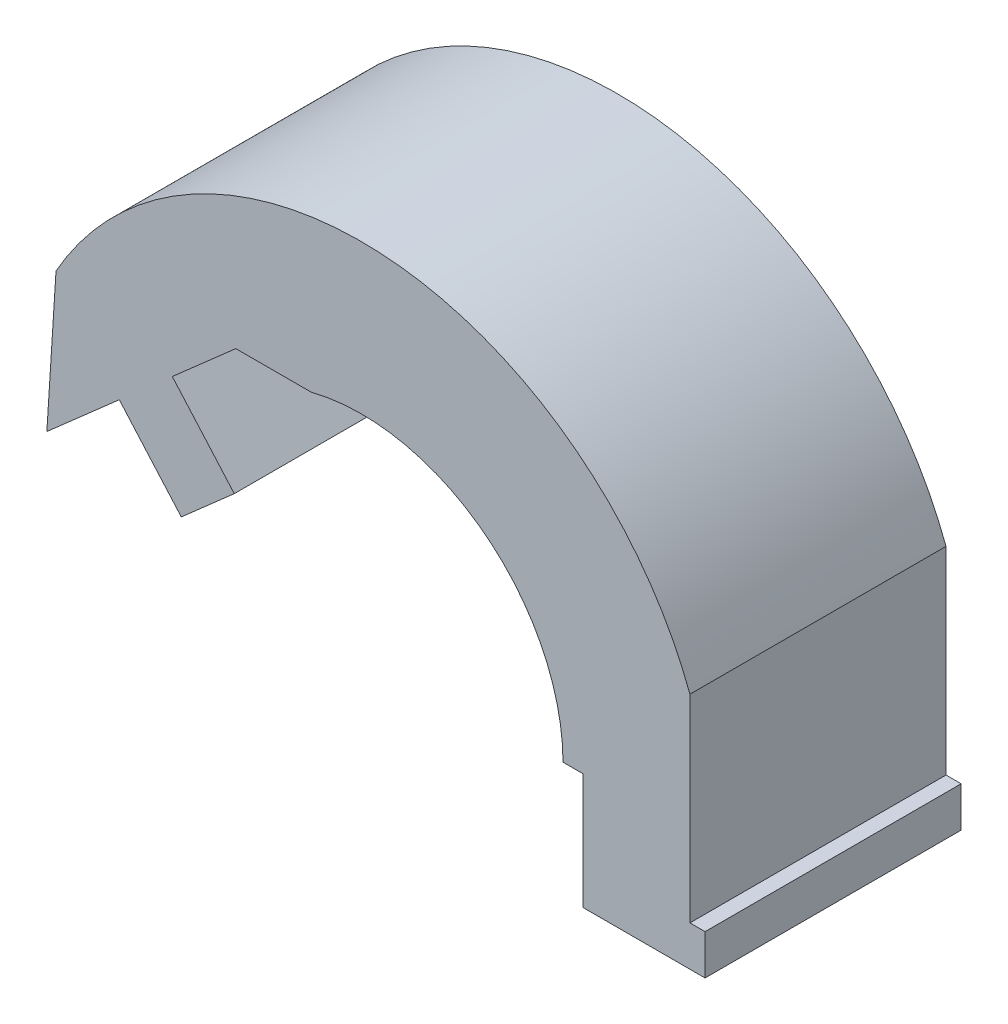
ISO-10303-21;
HEADER;
FILE_DESCRIPTION(('STEP AP214'),'2;1');
FILE_NAME('part.step','',(''),(''),'','','');
FILE_SCHEMA(('AUTOMOTIVE_DESIGN { 1 0 10303 214 1 1 1 1 }'));
ENDSEC;
DATA;
#1=APPLICATION_CONTEXT('core data for automotive mechanical design processes');
#2=APPLICATION_PROTOCOL_DEFINITION('international standard','automotive_design',2000,#1);
#3=PRODUCT_CONTEXT('',#1,'mechanical');
#4=PRODUCT('Part','Part','',(#3));
#5=PRODUCT_RELATED_PRODUCT_CATEGORY('part','',(#4));
#6=PRODUCT_DEFINITION_FORMATION('','',#4);
#7=PRODUCT_DEFINITION_CONTEXT('part definition',#1,'design');
#8=PRODUCT_DEFINITION('design','',#6,#7);
#9=PRODUCT_DEFINITION_SHAPE('','',#8);
#10=(LENGTH_UNIT() NAMED_UNIT(*) SI_UNIT(.MILLI.,.METRE.));
#11=(NAMED_UNIT(*) PLANE_ANGLE_UNIT() SI_UNIT($,.RADIAN.));
#12=(NAMED_UNIT(*) SI_UNIT($,.STERADIAN.) SOLID_ANGLE_UNIT());
#13=UNCERTAINTY_MEASURE_WITH_UNIT(LENGTH_MEASURE(1.E-05),#10,'distance_accuracy_value','');
#14=(GEOMETRIC_REPRESENTATION_CONTEXT(3) GLOBAL_UNCERTAINTY_ASSIGNED_CONTEXT((#13)) GLOBAL_UNIT_ASSIGNED_CONTEXT((#10,
#11,#12)) REPRESENTATION_CONTEXT('',''));
#15=CARTESIAN_POINT('',(0.,0.,0.));
#16=DIRECTION('',(0.,0.,1.));
#17=DIRECTION('',(1.,0.,0.));
#18=AXIS2_PLACEMENT_3D('',#15,#16,#17);
#19=CARTESIAN_POINT('',(-37.0887037482925,13.239242579813,-12.7));
#20=DIRECTION('',(0.660656213966803,-0.750688595189143,0.));
#21=DIRECTION('',(0.750688595189144,0.660656213966803,0.));
#22=AXIS2_PLACEMENT_3D('',#19,#20,#21);
#23=PLANE('',#22);
#24=DIRECTION('',(0.750688595189143,0.660656213966803,0.));
#25=VECTOR('',#24,1.);
#26=CARTESIAN_POINT('',(-37.0887037482925,13.239242579813,0.));
#27=LINE('',#26,#25);
#28=CARTESIAN_POINT('',(-37.2793786514705,13.0714359014654,0.));
#29=VERTEX_POINT('',#28);
#30=CARTESIAN_POINT('',(-34.1291770340786,15.8438241955142,0.));
#31=VERTEX_POINT('',#30);
#32=EDGE_CURVE('E212',#29,#31,#27,.T.);
#33=ORIENTED_EDGE('',*,*,#32,.F.);
#34=DIRECTION('',(0.,0.,1.));
#35=VECTOR('',#34,1.);
#36=CARTESIAN_POINT('',(-37.2793786514705,13.0714359014654,-12.7));
#37=LINE('',#36,#35);
#38=CARTESIAN_POINT('',(-37.2793786514705,13.0714359014654,-12.7));
#39=VERTEX_POINT('',#38);
#40=EDGE_CURVE('E11',#39,#29,#37,.T.);
#41=ORIENTED_EDGE('',*,*,#40,.F.);
#42=DIRECTION('',(0.750688595189145,0.660656213966802,0.));
#43=VECTOR('',#42,1.);
#44=CARTESIAN_POINT('',(-34.1291770340786,15.8438241955142,-12.7));
#45=LINE('',#44,#43);
#46=CARTESIAN_POINT('',(-34.1291770340786,15.8438241955142,-12.7));
#47=VERTEX_POINT('',#46);
#48=EDGE_CURVE('E52',#39,#47,#45,.T.);
#49=ORIENTED_EDGE('',*,*,#48,.T.);
#50=DIRECTION('',(0.,0.,1.));
#51=VECTOR('',#50,1.);
#52=CARTESIAN_POINT('',(-34.1291770340786,15.8438241955142,-12.7));
#53=LINE('',#52,#51);
#54=EDGE_CURVE('E37',#47,#31,#53,.T.);
#55=ORIENTED_EDGE('',*,*,#54,.T.);
#56=EDGE_LOOP('',(#33,#41,#49,#55));
#57=FACE_BOUND('',#56,.T.);
#58=ADVANCED_FACE('F33',(#57),#23,.T.);
#59=CARTESIAN_POINT('',(-37.2793786514705,13.0714359014654,-12.7));
#60=DIRECTION('',(0.750688595189145,0.660656213966801,0.));
#61=DIRECTION('',(-0.660656213966801,0.750688595189145,0.));
#62=AXIS2_PLACEMENT_3D('',#59,#60,#61);
#63=PLANE('',#62);
#64=DIRECTION('',(-0.660656213966801,0.750688595189145,0.));
#65=VECTOR('',#64,1.);
#66=CARTESIAN_POINT('',(-37.2793786514705,13.0714359014654,0.));
#67=LINE('',#66,#65);
#68=CARTESIAN_POINT('',(-34.203525113416,9.57641364529731,0.));
#69=VERTEX_POINT('',#68);
#70=EDGE_CURVE('E210',#69,#29,#67,.T.);
#71=ORIENTED_EDGE('',*,*,#70,.F.);
#72=DIRECTION('',(0.,0.,1.));
#73=VECTOR('',#72,1.);
#74=CARTESIAN_POINT('',(-34.203525113416,9.57641364529731,-12.7));
#75=LINE('',#74,#73);
#76=CARTESIAN_POINT('',(-34.203525113416,9.57641364529731,-12.7));
#77=VERTEX_POINT('',#76);
#78=EDGE_CURVE('E43',#77,#69,#75,.T.);
#79=ORIENTED_EDGE('',*,*,#78,.F.);
#80=DIRECTION('',(-0.660656213966801,0.750688595189145,0.));
#81=VECTOR('',#80,1.);
#82=CARTESIAN_POINT('',(-37.2793786514705,13.0714359014654,-12.7));
#83=LINE('',#82,#81);
#84=EDGE_CURVE('E163',#77,#39,#83,.T.);
#85=ORIENTED_EDGE('',*,*,#84,.T.);
#86=ORIENTED_EDGE('',*,*,#40,.T.);
#87=EDGE_LOOP('',(#71,#79,#85,#86));
#88=FACE_BOUND('',#87,.T.);
#89=ADVANCED_FACE('F241',(#88),#63,.T.);
#90=CARTESIAN_POINT('',(-34.203525113416,9.57641364529731,-12.7));
#91=DIRECTION('',(0.660656213966801,-0.750688595189145,0.));
#92=DIRECTION('',(0.750688595189145,0.660656213966801,0.));
#93=AXIS2_PLACEMENT_3D('',#90,#91,#92);
#94=PLANE('',#93);
#95=DIRECTION('',(0.750688595189145,0.660656213966801,0.));
#96=VECTOR('',#95,1.);
#97=CARTESIAN_POINT('',(-34.203525113416,9.57641364529731,0.));
#98=LINE('',#97,#96);
#99=CARTESIAN_POINT('',(-36.8326030830114,7.26264904470577,0.));
#100=VERTEX_POINT('',#99);
#101=EDGE_CURVE('E152',#100,#69,#98,.T.);
#102=ORIENTED_EDGE('',*,*,#101,.F.);
#103=DIRECTION('',(0.,0.,1.));
#104=VECTOR('',#103,1.);
#105=CARTESIAN_POINT('',(-36.8326030830114,7.26264904470577,-12.7));
#106=LINE('',#105,#104);
#107=CARTESIAN_POINT('',(-36.8326030830114,7.26264904470577,-12.7));
#108=VERTEX_POINT('',#107);
#109=EDGE_CURVE('E147',#108,#100,#106,.T.);
#110=ORIENTED_EDGE('',*,*,#109,.F.);
#111=DIRECTION('',(0.750688595189145,0.660656213966801,0.));
#112=VECTOR('',#111,1.);
#113=CARTESIAN_POINT('',(-34.203525113416,9.57641364529731,-12.7));
#114=LINE('',#113,#112);
#115=EDGE_CURVE('E150',#108,#77,#114,.T.);
#116=ORIENTED_EDGE('',*,*,#115,.T.);
#117=ORIENTED_EDGE('',*,*,#78,.T.);
#118=EDGE_LOOP('',(#102,#110,#116,#117));
#119=FACE_BOUND('',#118,.T.);
#120=ADVANCED_FACE('F149',(#119),#94,.T.);
#121=CARTESIAN_POINT('',(-36.8326030830114,7.26264904470577,-12.7));
#122=DIRECTION('',(-0.750688595189144,-0.660656213966802,0.));
#123=DIRECTION('',(0.660656213966802,-0.750688595189145,0.));
#124=AXIS2_PLACEMENT_3D('',#121,#122,#123);
#125=PLANE('',#124);
#126=DIRECTION('',(0.660656213966802,-0.750688595189145,0.));
#127=VECTOR('',#126,1.);
#128=CARTESIAN_POINT('',(-36.8326030830114,7.26264904470577,0.));
#129=LINE('',#128,#127);
#130=CARTESIAN_POINT('',(-39.908456621066,10.7576713008739,0.));
#131=VERTEX_POINT('',#130);
#132=EDGE_CURVE('E207',#131,#100,#129,.T.);
#133=ORIENTED_EDGE('',*,*,#132,.F.);
#134=DIRECTION('',(0.,0.,1.));
#135=VECTOR('',#134,1.);
#136=CARTESIAN_POINT('',(-39.908456621066,10.7576713008739,-12.7));
#137=LINE('',#136,#135);
#138=CARTESIAN_POINT('',(-39.908456621066,10.7576713008739,-12.7));
#139=VERTEX_POINT('',#138);
#140=EDGE_CURVE('E157',#139,#131,#137,.T.);
#141=ORIENTED_EDGE('',*,*,#140,.F.);
#142=DIRECTION('',(0.660656213966802,-0.750688595189145,0.));
#143=VECTOR('',#142,1.);
#144=CARTESIAN_POINT('',(-36.8326030830114,7.26264904470577,-12.7));
#145=LINE('',#144,#143);
#146=EDGE_CURVE('E162',#139,#108,#145,.T.);
#147=ORIENTED_EDGE('',*,*,#146,.T.);
#148=ORIENTED_EDGE('',*,*,#109,.T.);
#149=EDGE_LOOP('',(#133,#141,#147,#148));
#150=FACE_BOUND('',#149,.T.);
#151=ADVANCED_FACE('F166',(#150),#125,.T.);
#152=CARTESIAN_POINT('',(-39.908456621066,10.7576713008739,-12.7));
#153=DIRECTION('',(0.660656213966805,-0.750688595189142,0.));
#154=DIRECTION('',(0.750688595189142,0.660656213966805,0.));
#155=AXIS2_PLACEMENT_3D('',#152,#153,#154);
#156=PLANE('',#155);
#157=DIRECTION('',(0.750688595189142,0.660656213966805,0.));
#158=VECTOR('',#157,1.);
#159=CARTESIAN_POINT('',(-39.908456621066,10.7576713008739,0.));
#160=LINE('',#159,#158);
#161=CARTESIAN_POINT('',(-43.4993785853728,7.59741960024506,0.));
#162=VERTEX_POINT('',#161);
#163=EDGE_CURVE('E204',#162,#131,#160,.T.);
#164=ORIENTED_EDGE('',*,*,#163,.F.);
#165=DIRECTION('',(0.,0.,1.));
#166=VECTOR('',#165,1.);
#167=CARTESIAN_POINT('',(-43.4993785853728,7.59741960024506,-12.7));
#168=LINE('',#167,#166);
#169=CARTESIAN_POINT('',(-43.4993785853728,7.59741960024506,-12.7));
#170=VERTEX_POINT('',#169);
#171=EDGE_CURVE('E216',#170,#162,#168,.T.);
#172=ORIENTED_EDGE('',*,*,#171,.F.);
#173=DIRECTION('',(0.750688595189145,0.660656213966802,0.));
#174=VECTOR('',#173,1.);
#175=CARTESIAN_POINT('',(-40.099131524244,10.5898646225263,-12.7));
#176=LINE('',#175,#174);
#177=EDGE_CURVE('E167',#170,#139,#176,.T.);
#178=ORIENTED_EDGE('',*,*,#177,.T.);
#179=ORIENTED_EDGE('',*,*,#140,.T.);
#180=EDGE_LOOP('',(#164,#172,#178,#179));
#181=FACE_BOUND('',#180,.T.);
#182=ADVANCED_FACE('F254',(#181),#156,.T.);
#183=CARTESIAN_POINT('',(-43.4993785853728,7.59741960024506,-12.7));
#184=DIRECTION('',(-0.997971485146603,0.063662507288697,0.));
#185=DIRECTION('',(-0.063662507288697,-0.997971485146603,0.));
#186=AXIS2_PLACEMENT_3D('',#183,#184,#185);
#187=PLANE('',#186);
#188=DIRECTION('',(-0.063662507288697,-0.997971485146603,0.));
#189=VECTOR('',#188,1.);
#190=CARTESIAN_POINT('',(-43.4993785853728,7.59741960024506,0.));
#191=LINE('',#190,#189);
#192=CARTESIAN_POINT('',(-43.0448033362151,14.7233270744121,0.));
#193=VERTEX_POINT('',#192);
#194=EDGE_CURVE('E201',#193,#162,#191,.T.);
#195=ORIENTED_EDGE('',*,*,#194,.F.);
#196=DIRECTION('',(0.,0.,1.));
#197=VECTOR('',#196,1.);
#198=CARTESIAN_POINT('',(-43.0448033362151,14.7233270744121,-12.7));
#199=LINE('',#198,#197);
#200=CARTESIAN_POINT('',(-43.0448033362151,14.7233270744121,-12.7));
#201=VERTEX_POINT('',#200);
#202=EDGE_CURVE('E219',#201,#193,#199,.T.);
#203=ORIENTED_EDGE('',*,*,#202,.F.);
#204=DIRECTION('',(-0.063662507288697,-0.997971485146603,0.));
#205=VECTOR('',#204,1.);
#206=CARTESIAN_POINT('',(-43.4993785853728,7.59741960024506,-12.7));
#207=LINE('',#206,#205);
#208=EDGE_CURVE('E169',#201,#170,#207,.T.);
#209=ORIENTED_EDGE('',*,*,#208,.T.);
#210=ORIENTED_EDGE('',*,*,#171,.T.);
#211=EDGE_LOOP('',(#195,#203,#209,#210));
#212=FACE_BOUND('',#211,.T.);
#213=ADVANCED_FACE('F257',(#212),#187,.T.);
#214=CARTESIAN_POINT('',(-27.9001518850458,6.15597436645182,-12.7));
#215=DIRECTION('',(0.,0.,1.));
#216=DIRECTION('',(1.,0.,0.));
#217=AXIS2_PLACEMENT_3D('',#214,#215,#216);
#218=CYLINDRICAL_SURFACE('',#217,17.4);
#219=CARTESIAN_POINT('',(-27.9001518850458,6.15597436645182,0.));
#220=DIRECTION('',(0.,0.,1.));
#221=DIRECTION('',(1.,0.,0.));
#222=AXIS2_PLACEMENT_3D('',#219,#220,#221);
#223=CIRCLE('',#222,17.4);
#224=CARTESIAN_POINT('',(-11.6068158201376,12.2622989464232,0.));
#225=VERTEX_POINT('',#224);
#226=EDGE_CURVE('E198',#225,#193,#223,.T.);
#227=ORIENTED_EDGE('',*,*,#226,.F.);
#228=DIRECTION('',(0.,0.,1.));
#229=VECTOR('',#228,1.);
#230=CARTESIAN_POINT('',(-11.6068158201376,12.2622989464232,-12.7));
#231=LINE('',#230,#229);
#232=CARTESIAN_POINT('',(-11.6068158201376,12.2622989464232,-12.7));
#233=VERTEX_POINT('',#232);
#234=EDGE_CURVE('E221',#233,#225,#231,.T.);
#235=ORIENTED_EDGE('',*,*,#234,.F.);
#236=CARTESIAN_POINT('',(-27.9001518850458,6.15597436645182,-12.7));
#237=DIRECTION('',(0.,0.,1.));
#238=DIRECTION('',(1.,0.,0.));
#239=AXIS2_PLACEMENT_3D('',#236,#237,#238);
#240=CIRCLE('',#239,17.4);
#241=EDGE_CURVE('E322',#233,#201,#240,.T.);
#242=ORIENTED_EDGE('',*,*,#241,.T.);
#243=ORIENTED_EDGE('',*,*,#202,.T.);
#244=EDGE_LOOP('',(#227,#235,#242,#243));
#245=FACE_BOUND('',#244,.T.);
#246=ADVANCED_FACE('F261',(#245),#218,.T.);
#247=CARTESIAN_POINT('',(-11.6068158201376,5.15464013008593,-12.7));
#248=DIRECTION('',(1.,0.,0.));
#249=DIRECTION('',(0.,1.,0.));
#250=AXIS2_PLACEMENT_3D('',#247,#248,#249);
#251=PLANE('',#250);
#252=DIRECTION('',(0.,1.,0.));
#253=VECTOR('',#252,1.);
#254=CARTESIAN_POINT('',(-11.6068158201376,5.15464013008593,0.));
#255=LINE('',#254,#253);
#256=CARTESIAN_POINT('',(-11.6068158201376,2.44075228779337,0.));
#257=VERTEX_POINT('',#256);
#258=EDGE_CURVE('E195',#257,#225,#255,.T.);
#259=ORIENTED_EDGE('',*,*,#258,.F.);
#260=DIRECTION('',(0.,0.,1.));
#261=VECTOR('',#260,1.);
#262=CARTESIAN_POINT('',(-11.6068158201376,2.44075228779337,-12.7));
#263=LINE('',#262,#261);
#264=CARTESIAN_POINT('',(-11.6068158201376,2.44075228779337,-12.7));
#265=VERTEX_POINT('',#264);
#266=EDGE_CURVE('E223',#265,#257,#263,.T.);
#267=ORIENTED_EDGE('',*,*,#266,.F.);
#268=DIRECTION('',(0.,1.,0.));
#269=VECTOR('',#268,1.);
#270=CARTESIAN_POINT('',(-11.6068158201376,5.15464013008593,-12.7));
#271=LINE('',#270,#269);
#272=EDGE_CURVE('E317',#265,#233,#271,.T.);
#273=ORIENTED_EDGE('',*,*,#272,.T.);
#274=ORIENTED_EDGE('',*,*,#234,.T.);
#275=EDGE_LOOP('',(#259,#267,#273,#274));
#276=FACE_BOUND('',#275,.T.);
#277=ADVANCED_FACE('F265',(#276),#251,.T.);
#278=CARTESIAN_POINT('',(-11.6068158201376,2.44075228779337,-12.7));
#279=DIRECTION('',(0.,1.,0.));
#280=DIRECTION('',(0.,0.,1.));
#281=AXIS2_PLACEMENT_3D('',#278,#279,#280);
#282=PLANE('',#281);
#283=DIRECTION('',(-1.,0.,0.));
#284=VECTOR('',#283,1.);
#285=CARTESIAN_POINT('',(-11.6068158201376,2.44075228779337,0.));
#286=LINE('',#285,#284);
#287=CARTESIAN_POINT('',(-10.8568158201376,2.44075228779337,0.));
#288=VERTEX_POINT('',#287);
#289=EDGE_CURVE('E192',#288,#257,#286,.T.);
#290=ORIENTED_EDGE('',*,*,#289,.F.);
#291=DIRECTION('',(0.,0.,1.));
#292=VECTOR('',#291,1.);
#293=CARTESIAN_POINT('',(-10.8568158201376,2.44075228779337,-12.7));
#294=LINE('',#293,#292);
#295=CARTESIAN_POINT('',(-10.8568158201376,2.44075228779337,-12.7));
#296=VERTEX_POINT('',#295);
#297=EDGE_CURVE('E226',#296,#288,#294,.T.);
#298=ORIENTED_EDGE('',*,*,#297,.F.);
#299=DIRECTION('',(-1.,0.,0.));
#300=VECTOR('',#299,1.);
#301=CARTESIAN_POINT('',(-11.6068158201376,2.44075228779337,-12.7));
#302=LINE('',#301,#300);
#303=EDGE_CURVE('E315',#296,#265,#302,.T.);
#304=ORIENTED_EDGE('',*,*,#303,.T.);
#305=ORIENTED_EDGE('',*,*,#266,.T.);
#306=EDGE_LOOP('',(#290,#298,#304,#305));
#307=FACE_BOUND('',#306,.T.);
#308=ADVANCED_FACE('F269',(#307),#282,.T.);
#309=CARTESIAN_POINT('',(-10.8568158201376,2.44075228779337,-12.7));
#310=DIRECTION('',(1.,0.,0.));
#311=DIRECTION('',(0.,0.,-1.));
#312=AXIS2_PLACEMENT_3D('',#309,#310,#311);
#313=PLANE('',#312);
#314=DIRECTION('',(0.,1.,0.));
#315=VECTOR('',#314,1.);
#316=CARTESIAN_POINT('',(-10.8568158201376,2.44075228779337,0.));
#317=LINE('',#316,#315);
#318=CARTESIAN_POINT('',(-10.8568158201376,0.448752287793373,0.));
#319=VERTEX_POINT('',#318);
#320=EDGE_CURVE('E189',#319,#288,#317,.T.);
#321=ORIENTED_EDGE('',*,*,#320,.F.);
#322=DIRECTION('',(0.,0.,1.));
#323=VECTOR('',#322,1.);
#324=CARTESIAN_POINT('',(-10.8568158201376,0.448752287793373,-12.7));
#325=LINE('',#324,#323);
#326=CARTESIAN_POINT('',(-10.8568158201376,0.448752287793373,-12.7));
#327=VERTEX_POINT('',#326);
#328=EDGE_CURVE('E228',#327,#319,#325,.T.);
#329=ORIENTED_EDGE('',*,*,#328,.F.);
#330=DIRECTION('',(0.,1.,0.));
#331=VECTOR('',#330,1.);
#332=CARTESIAN_POINT('',(-10.8568158201376,2.44075228779337,-12.7));
#333=LINE('',#332,#331);
#334=EDGE_CURVE('E325',#327,#296,#333,.T.);
#335=ORIENTED_EDGE('',*,*,#334,.T.);
#336=ORIENTED_EDGE('',*,*,#297,.T.);
#337=EDGE_LOOP('',(#321,#329,#335,#336));
#338=FACE_BOUND('',#337,.T.);
#339=ADVANCED_FACE('F273',(#338),#313,.T.);
#340=CARTESIAN_POINT('',(-10.8568158201376,0.448752287793373,-12.7));
#341=DIRECTION('',(0.,-1.,0.));
#342=DIRECTION('',(1.,0.,0.));
#343=AXIS2_PLACEMENT_3D('',#340,#341,#342);
#344=PLANE('',#343);
#345=DIRECTION('',(1.,0.,0.));
#346=VECTOR('',#345,1.);
#347=CARTESIAN_POINT('',(-10.8568158201376,0.448752287793373,0.));
#348=LINE('',#347,#346);
#349=CARTESIAN_POINT('',(-16.916890921633,0.448752287793371,0.));
#350=VERTEX_POINT('',#349);
#351=EDGE_CURVE('E186',#350,#319,#348,.T.);
#352=ORIENTED_EDGE('',*,*,#351,.F.);
#353=DIRECTION('',(0.,0.,1.));
#354=VECTOR('',#353,1.);
#355=CARTESIAN_POINT('',(-16.916890921633,0.448752287793371,-12.7));
#356=LINE('',#355,#354);
#357=CARTESIAN_POINT('',(-16.916890921633,0.448752287793371,-12.7));
#358=VERTEX_POINT('',#357);
#359=EDGE_CURVE('E230',#358,#350,#356,.T.);
#360=ORIENTED_EDGE('',*,*,#359,.F.);
#361=DIRECTION('',(1.,0.,0.));
#362=VECTOR('',#361,1.);
#363=CARTESIAN_POINT('',(-10.8568158201376,0.448752287793373,-12.7));
#364=LINE('',#363,#362);
#365=EDGE_CURVE('E309',#358,#327,#364,.T.);
#366=ORIENTED_EDGE('',*,*,#365,.T.);
#367=ORIENTED_EDGE('',*,*,#328,.T.);
#368=EDGE_LOOP('',(#352,#360,#366,#367));
#369=FACE_BOUND('',#368,.T.);
#370=ADVANCED_FACE('F277',(#369),#344,.T.);
#371=CARTESIAN_POINT('',(-16.916890921633,0.448752287793371,-12.7));
#372=DIRECTION('',(-1.,0.,0.));
#373=DIRECTION('',(0.,0.,1.));
#374=AXIS2_PLACEMENT_3D('',#371,#372,#373);
#375=PLANE('',#374);
#376=DIRECTION('',(0.,-1.,0.));
#377=VECTOR('',#376,1.);
#378=CARTESIAN_POINT('',(-16.916890921633,0.448752287793371,0.));
#379=LINE('',#378,#377);
#380=CARTESIAN_POINT('',(-16.916890921633,6.19475228779337,0.));
#381=VERTEX_POINT('',#380);
#382=EDGE_CURVE('E183',#381,#350,#379,.T.);
#383=ORIENTED_EDGE('',*,*,#382,.F.);
#384=DIRECTION('',(0.,0.,1.));
#385=VECTOR('',#384,1.);
#386=CARTESIAN_POINT('',(-16.916890921633,6.19475228779337,-12.7));
#387=LINE('',#386,#385);
#388=CARTESIAN_POINT('',(-16.916890921633,6.19475228779337,-12.7));
#389=VERTEX_POINT('',#388);
#390=EDGE_CURVE('E232',#389,#381,#387,.T.);
#391=ORIENTED_EDGE('',*,*,#390,.F.);
#392=DIRECTION('',(0.,-1.,0.));
#393=VECTOR('',#392,1.);
#394=CARTESIAN_POINT('',(-16.916890921633,0.448752287793371,-12.7));
#395=LINE('',#394,#393);
#396=EDGE_CURVE('E305',#389,#358,#395,.T.);
#397=ORIENTED_EDGE('',*,*,#396,.T.);
#398=ORIENTED_EDGE('',*,*,#359,.T.);
#399=EDGE_LOOP('',(#383,#391,#397,#398));
#400=FACE_BOUND('',#399,.T.);
#401=ADVANCED_FACE('F281',(#400),#375,.T.);
#402=CARTESIAN_POINT('',(-17.9002270716876,6.19475228779368,-12.7));
#403=DIRECTION('',(-3.140134517649E-13,-1.,0.));
#404=DIRECTION('',(1.,-3.140134517649E-13,0.));
#405=AXIS2_PLACEMENT_3D('',#402,#403,#404);
#406=PLANE('',#405);
#407=DIRECTION('',(1.,-3.140134517649E-13,0.));
#408=VECTOR('',#407,1.);
#409=CARTESIAN_POINT('',(-17.9002270716876,6.19475228779368,0.));
#410=LINE('',#409,#408);
#411=CARTESIAN_POINT('',(-17.9002270716876,6.19475228779368,0.));
#412=VERTEX_POINT('',#411);
#413=EDGE_CURVE('E180',#412,#381,#410,.T.);
#414=ORIENTED_EDGE('',*,*,#413,.F.);
#415=DIRECTION('',(0.,0.,1.));
#416=VECTOR('',#415,1.);
#417=CARTESIAN_POINT('',(-17.9002270716876,6.19475228779368,-12.7));
#418=LINE('',#417,#416);
#419=CARTESIAN_POINT('',(-17.9002270716876,6.19475228779368,-12.7));
#420=VERTEX_POINT('',#419);
#421=EDGE_CURVE('E234',#420,#412,#418,.T.);
#422=ORIENTED_EDGE('',*,*,#421,.F.);
#423=DIRECTION('',(1.,-3.140134517649E-13,0.));
#424=VECTOR('',#423,1.);
#425=CARTESIAN_POINT('',(-17.9002270716876,6.19475228779368,-12.7));
#426=LINE('',#425,#424);
#427=EDGE_CURVE('E334',#420,#389,#426,.T.);
#428=ORIENTED_EDGE('',*,*,#427,.T.);
#429=ORIENTED_EDGE('',*,*,#390,.T.);
#430=EDGE_LOOP('',(#414,#422,#428,#429));
#431=FACE_BOUND('',#430,.T.);
#432=ADVANCED_FACE('F285',(#431),#406,.T.);
#433=CARTESIAN_POINT('',(-27.9001518850458,6.15597436645182,-12.7));
#434=DIRECTION('',(0.,0.,1.));
#435=DIRECTION('',(1.,0.,0.));
#436=AXIS2_PLACEMENT_3D('',#433,#434,#435);
#437=CYLINDRICAL_SURFACE('',#436,10.);
#438=CARTESIAN_POINT('',(-27.9001518850458,6.15597436645182,0.));
#439=DIRECTION('',(0.,0.,-1.));
#440=DIRECTION('',(-1.,0.,0.));
#441=AXIS2_PLACEMENT_3D('',#438,#439,#440);
#442=CIRCLE('',#441,10.);
#443=CARTESIAN_POINT('',(-30.3791770340786,15.8438241955141,0.));
#444=VERTEX_POINT('',#443);
#445=EDGE_CURVE('E177',#444,#412,#442,.T.);
#446=ORIENTED_EDGE('',*,*,#445,.F.);
#447=DIRECTION('',(0.,0.,1.));
#448=VECTOR('',#447,1.);
#449=CARTESIAN_POINT('',(-30.3791770340786,15.8438241955141,-12.7));
#450=LINE('',#449,#448);
#451=CARTESIAN_POINT('',(-30.3791770340786,15.8438241955141,-12.7));
#452=VERTEX_POINT('',#451);
#453=EDGE_CURVE('E235',#452,#444,#450,.T.);
#454=ORIENTED_EDGE('',*,*,#453,.F.);
#455=CARTESIAN_POINT('',(-27.9001518850458,6.15597436645182,-12.7));
#456=DIRECTION('',(0.,0.,-1.));
#457=DIRECTION('',(-1.,0.,0.));
#458=AXIS2_PLACEMENT_3D('',#455,#456,#457);
#459=CIRCLE('',#458,10.);
#460=EDGE_CURVE('E298',#452,#420,#459,.T.);
#461=ORIENTED_EDGE('',*,*,#460,.T.);
#462=ORIENTED_EDGE('',*,*,#421,.T.);
#463=EDGE_LOOP('',(#446,#454,#461,#462));
#464=FACE_BOUND('',#463,.T.);
#465=ADVANCED_FACE('F288',(#464),#437,.F.);
#466=CARTESIAN_POINT('',(-30.3791770340786,15.8438241955141,-12.7));
#467=DIRECTION('',(0.,-1.,0.));
#468=DIRECTION('',(1.,0.,0.));
#469=AXIS2_PLACEMENT_3D('',#466,#467,#468);
#470=PLANE('',#469);
#471=DIRECTION('',(1.,0.,0.));
#472=VECTOR('',#471,1.);
#473=CARTESIAN_POINT('',(-30.3791770340786,15.8438241955141,0.));
#474=LINE('',#473,#472);
#475=EDGE_CURVE('E174',#31,#444,#474,.T.);
#476=ORIENTED_EDGE('',*,*,#475,.F.);
#477=ORIENTED_EDGE('',*,*,#54,.F.);
#478=DIRECTION('',(1.,0.,0.));
#479=VECTOR('',#478,1.);
#480=CARTESIAN_POINT('',(-30.3791770340786,15.8438241955141,-12.7));
#481=LINE('',#480,#479);
#482=EDGE_CURVE('E337',#47,#452,#481,.T.);
#483=ORIENTED_EDGE('',*,*,#482,.T.);
#484=ORIENTED_EDGE('',*,*,#453,.T.);
#485=EDGE_LOOP('',(#476,#477,#483,#484));
#486=FACE_BOUND('',#485,.T.);
#487=ADVANCED_FACE('F35',(#486),#470,.T.);
#488=CARTESIAN_POINT('',(-27.9001518850458,6.15597436645182,-12.7));
#489=DIRECTION('',(0.,0.,1.));
#490=DIRECTION('',(1.,0.,0.));
#491=AXIS2_PLACEMENT_3D('',#488,#489,#490);
#492=PLANE('',#491);
#493=ORIENTED_EDGE('',*,*,#48,.F.);
#494=ORIENTED_EDGE('',*,*,#84,.F.);
#495=ORIENTED_EDGE('',*,*,#115,.F.);
#496=ORIENTED_EDGE('',*,*,#146,.F.);
#497=ORIENTED_EDGE('',*,*,#177,.F.);
#498=ORIENTED_EDGE('',*,*,#208,.F.);
#499=ORIENTED_EDGE('',*,*,#241,.F.);
#500=ORIENTED_EDGE('',*,*,#272,.F.);
#501=ORIENTED_EDGE('',*,*,#303,.F.);
#502=ORIENTED_EDGE('',*,*,#334,.F.);
#503=ORIENTED_EDGE('',*,*,#365,.F.);
#504=ORIENTED_EDGE('',*,*,#396,.F.);
#505=ORIENTED_EDGE('',*,*,#427,.F.);
#506=ORIENTED_EDGE('',*,*,#460,.F.);
#507=ORIENTED_EDGE('',*,*,#482,.F.);
#508=EDGE_LOOP('',(#493,#494,#495,#496,#497,#498,#499,#500,#501,#502,#503,#504,#505,#506,#507));
#509=FACE_BOUND('',#508,.T.);
#510=ADVANCED_FACE('F160',(#509),#492,.F.);
#511=CARTESIAN_POINT('',(-27.9001518850458,6.15597436645182,0.));
#512=DIRECTION('',(0.,0.,1.));
#513=DIRECTION('',(1.,0.,0.));
#514=AXIS2_PLACEMENT_3D('',#511,#512,#513);
#515=PLANE('',#514);
#516=ORIENTED_EDGE('',*,*,#32,.T.);
#517=ORIENTED_EDGE('',*,*,#475,.T.);
#518=ORIENTED_EDGE('',*,*,#445,.T.);
#519=ORIENTED_EDGE('',*,*,#413,.T.);
#520=ORIENTED_EDGE('',*,*,#382,.T.);
#521=ORIENTED_EDGE('',*,*,#351,.T.);
#522=ORIENTED_EDGE('',*,*,#320,.T.);
#523=ORIENTED_EDGE('',*,*,#289,.T.);
#524=ORIENTED_EDGE('',*,*,#258,.T.);
#525=ORIENTED_EDGE('',*,*,#226,.T.);
#526=ORIENTED_EDGE('',*,*,#194,.T.);
#527=ORIENTED_EDGE('',*,*,#163,.T.);
#528=ORIENTED_EDGE('',*,*,#132,.T.);
#529=ORIENTED_EDGE('',*,*,#101,.T.);
#530=ORIENTED_EDGE('',*,*,#70,.T.);
#531=EDGE_LOOP('',(#516,#517,#518,#519,#520,#521,#522,#523,#524,#525,#526,#527,#528,#529,#530));
#532=FACE_BOUND('',#531,.T.);
#533=ADVANCED_FACE('F240',(#532),#515,.T.);
#534=CLOSED_SHELL('',(#58,#89,#120,#151,#182,#213,#246,#277,#308,#339,#370,#401,#432,#465,#487,
#510,#533));
#535=MANIFOLD_SOLID_BREP('B2',#534);
#536=ADVANCED_BREP_SHAPE_REPRESENTATION('',(#18,#535),#14);
#537=SHAPE_DEFINITION_REPRESENTATION(#9,#536);
ENDSEC;
END-ISO-10303-21;
